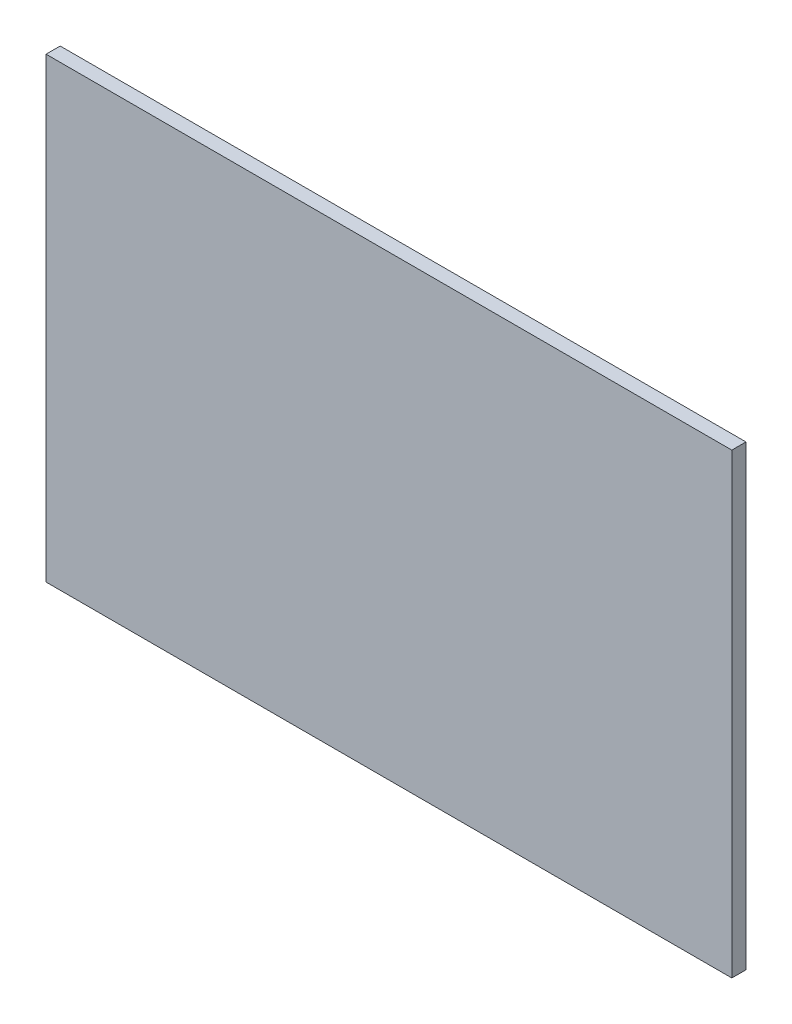
ISO-10303-21;
HEADER;
FILE_DESCRIPTION(('STEP AP214'),'2;1');
FILE_NAME('part.step','',(''),(''),'','','');
FILE_SCHEMA(('AUTOMOTIVE_DESIGN { 1 0 10303 214 1 1 1 1 }'));
ENDSEC;
DATA;
#1=APPLICATION_CONTEXT('core data for automotive mechanical design processes');
#2=APPLICATION_PROTOCOL_DEFINITION('international standard','automotive_design',2000,#1);
#3=PRODUCT_CONTEXT('',#1,'mechanical');
#4=PRODUCT('Part','Part','',(#3));
#5=PRODUCT_RELATED_PRODUCT_CATEGORY('part','',(#4));
#6=PRODUCT_DEFINITION_FORMATION('','',#4);
#7=PRODUCT_DEFINITION_CONTEXT('part definition',#1,'design');
#8=PRODUCT_DEFINITION('design','',#6,#7);
#9=PRODUCT_DEFINITION_SHAPE('','',#8);
#10=(LENGTH_UNIT() NAMED_UNIT(*) SI_UNIT(.MILLI.,.METRE.));
#11=(NAMED_UNIT(*) PLANE_ANGLE_UNIT() SI_UNIT($,.RADIAN.));
#12=(NAMED_UNIT(*) SI_UNIT($,.STERADIAN.) SOLID_ANGLE_UNIT());
#13=UNCERTAINTY_MEASURE_WITH_UNIT(LENGTH_MEASURE(1.E-05),#10,'distance_accuracy_value','');
#14=(GEOMETRIC_REPRESENTATION_CONTEXT(3) GLOBAL_UNCERTAINTY_ASSIGNED_CONTEXT((#13)) GLOBAL_UNIT_ASSIGNED_CONTEXT((#10,
#11,#12)) REPRESENTATION_CONTEXT('',''));
#15=CARTESIAN_POINT('',(0.,0.,0.));
#16=DIRECTION('',(0.,0.,1.));
#17=DIRECTION('',(1.,0.,0.));
#18=AXIS2_PLACEMENT_3D('',#15,#16,#17);
#19=CARTESIAN_POINT('',(0.,0.,6.));
#20=DIRECTION('',(1.,0.,0.));
#21=DIRECTION('',(0.,1.,0.));
#22=AXIS2_PLACEMENT_3D('',#19,#20,#21);
#23=PLANE('',#22);
#24=DIRECTION('',(0.,-1.,0.));
#25=VECTOR('',#24,1.);
#26=CARTESIAN_POINT('',(0.,0.,0.));
#27=LINE('',#26,#25);
#28=CARTESIAN_POINT('',(0.,0.,0.));
#29=VERTEX_POINT('',#28);
#30=CARTESIAN_POINT('',(0.,-194.,0.));
#31=VERTEX_POINT('',#30);
#32=EDGE_CURVE('E96',#29,#31,#27,.T.);
#33=ORIENTED_EDGE('',*,*,#32,.T.);
#34=DIRECTION('',(0.,0.,-1.));
#35=VECTOR('',#34,1.);
#36=CARTESIAN_POINT('',(0.,-194.,6.));
#37=LINE('',#36,#35);
#38=CARTESIAN_POINT('',(0.,-194.,6.));
#39=VERTEX_POINT('',#38);
#40=EDGE_CURVE('E11',#39,#31,#37,.T.);
#41=ORIENTED_EDGE('',*,*,#40,.F.);
#42=DIRECTION('',(0.,-1.,0.));
#43=VECTOR('',#42,1.);
#44=CARTESIAN_POINT('',(0.,0.,6.));
#45=LINE('',#44,#43);
#46=CARTESIAN_POINT('',(0.,0.,6.));
#47=VERTEX_POINT('',#46);
#48=EDGE_CURVE('E82',#47,#39,#45,.T.);
#49=ORIENTED_EDGE('',*,*,#48,.F.);
#50=DIRECTION('',(0.,0.,-1.));
#51=VECTOR('',#50,1.);
#52=CARTESIAN_POINT('',(0.,0.,6.));
#53=LINE('',#52,#51);
#54=EDGE_CURVE('E49',#47,#29,#53,.T.);
#55=ORIENTED_EDGE('',*,*,#54,.T.);
#56=EDGE_LOOP('',(#33,#41,#49,#55));
#57=FACE_BOUND('',#56,.T.);
#58=ADVANCED_FACE('F33',(#57),#23,.F.);
#59=CARTESIAN_POINT('',(0.,-194.,6.));
#60=DIRECTION('',(0.,1.,0.));
#61=DIRECTION('',(-1.,0.,0.));
#62=AXIS2_PLACEMENT_3D('',#59,#60,#61);
#63=PLANE('',#62);
#64=DIRECTION('',(1.,0.,0.));
#65=VECTOR('',#64,1.);
#66=CARTESIAN_POINT('',(0.,-194.,0.));
#67=LINE('',#66,#65);
#68=CARTESIAN_POINT('',(291.,-194.,0.));
#69=VERTEX_POINT('',#68);
#70=EDGE_CURVE('E88',#31,#69,#67,.T.);
#71=ORIENTED_EDGE('',*,*,#70,.T.);
#72=DIRECTION('',(0.,0.,-1.));
#73=VECTOR('',#72,1.);
#74=CARTESIAN_POINT('',(291.,-194.,6.));
#75=LINE('',#74,#73);
#76=CARTESIAN_POINT('',(291.,-194.,6.));
#77=VERTEX_POINT('',#76);
#78=EDGE_CURVE('E41',#77,#69,#75,.T.);
#79=ORIENTED_EDGE('',*,*,#78,.F.);
#80=DIRECTION('',(1.,0.,0.));
#81=VECTOR('',#80,1.);
#82=CARTESIAN_POINT('',(0.,-194.,6.));
#83=LINE('',#82,#81);
#84=EDGE_CURVE('E75',#39,#77,#83,.T.);
#85=ORIENTED_EDGE('',*,*,#84,.F.);
#86=ORIENTED_EDGE('',*,*,#40,.T.);
#87=EDGE_LOOP('',(#71,#79,#85,#86));
#88=FACE_BOUND('',#87,.T.);
#89=ADVANCED_FACE('F87',(#88),#63,.F.);
#90=CARTESIAN_POINT('',(291.,0.,6.));
#91=DIRECTION('',(1.,0.,0.));
#92=DIRECTION('',(0.,0.,-1.));
#93=AXIS2_PLACEMENT_3D('',#90,#91,#92);
#94=PLANE('',#93);
#95=DIRECTION('',(0.,-1.,0.));
#96=VECTOR('',#95,1.);
#97=CARTESIAN_POINT('',(291.,0.,0.));
#98=LINE('',#97,#96);
#99=CARTESIAN_POINT('',(291.,0.,0.));
#100=VERTEX_POINT('',#99);
#101=EDGE_CURVE('E99',#100,#69,#98,.T.);
#102=ORIENTED_EDGE('',*,*,#101,.F.);
#103=DIRECTION('',(0.,0.,-1.));
#104=VECTOR('',#103,1.);
#105=CARTESIAN_POINT('',(291.,0.,6.));
#106=LINE('',#105,#104);
#107=CARTESIAN_POINT('',(291.,0.,6.));
#108=VERTEX_POINT('',#107);
#109=EDGE_CURVE('E64',#108,#100,#106,.T.);
#110=ORIENTED_EDGE('',*,*,#109,.F.);
#111=DIRECTION('',(0.,-1.,0.));
#112=VECTOR('',#111,1.);
#113=CARTESIAN_POINT('',(291.,-122.,6.));
#114=LINE('',#113,#112);
#115=EDGE_CURVE('E81',#108,#77,#114,.T.);
#116=ORIENTED_EDGE('',*,*,#115,.T.);
#117=ORIENTED_EDGE('',*,*,#78,.T.);
#118=EDGE_LOOP('',(#102,#110,#116,#117));
#119=FACE_BOUND('',#118,.T.);
#120=ADVANCED_FACE('F90',(#119),#94,.T.);
#121=CARTESIAN_POINT('',(0.,0.,6.));
#122=DIRECTION('',(0.,1.,0.));
#123=DIRECTION('',(0.,0.,1.));
#124=AXIS2_PLACEMENT_3D('',#121,#122,#123);
#125=PLANE('',#124);
#126=DIRECTION('',(1.,0.,0.));
#127=VECTOR('',#126,1.);
#128=CARTESIAN_POINT('',(0.,0.,0.));
#129=LINE('',#128,#127);
#130=EDGE_CURVE('E101',#29,#100,#129,.T.);
#131=ORIENTED_EDGE('',*,*,#130,.F.);
#132=ORIENTED_EDGE('',*,*,#54,.F.);
#133=DIRECTION('',(1.,0.,0.));
#134=VECTOR('',#133,1.);
#135=CARTESIAN_POINT('',(0.,0.,6.));
#136=LINE('',#135,#134);
#137=EDGE_CURVE('E91',#47,#108,#136,.T.);
#138=ORIENTED_EDGE('',*,*,#137,.T.);
#139=ORIENTED_EDGE('',*,*,#109,.T.);
#140=EDGE_LOOP('',(#131,#132,#138,#139));
#141=FACE_BOUND('',#140,.T.);
#142=ADVANCED_FACE('F107',(#141),#125,.T.);
#143=CARTESIAN_POINT('',(0.,0.,6.));
#144=DIRECTION('',(0.,0.,1.));
#145=DIRECTION('',(1.,0.,0.));
#146=AXIS2_PLACEMENT_3D('',#143,#144,#145);
#147=PLANE('',#146);
#148=ORIENTED_EDGE('',*,*,#48,.T.);
#149=ORIENTED_EDGE('',*,*,#84,.T.);
#150=ORIENTED_EDGE('',*,*,#115,.F.);
#151=ORIENTED_EDGE('',*,*,#137,.F.);
#152=EDGE_LOOP('',(#148,#149,#150,#151));
#153=FACE_BOUND('',#152,.T.);
#154=ADVANCED_FACE('F78',(#153),#147,.T.);
#155=CARTESIAN_POINT('',(0.,0.,0.));
#156=DIRECTION('',(0.,0.,1.));
#157=DIRECTION('',(1.,0.,0.));
#158=AXIS2_PLACEMENT_3D('',#155,#156,#157);
#159=PLANE('',#158);
#160=ORIENTED_EDGE('',*,*,#32,.F.);
#161=ORIENTED_EDGE('',*,*,#130,.T.);
#162=ORIENTED_EDGE('',*,*,#101,.T.);
#163=ORIENTED_EDGE('',*,*,#70,.F.);
#164=EDGE_LOOP('',(#160,#161,#162,#163));
#165=FACE_BOUND('',#164,.T.);
#166=ADVANCED_FACE('F106',(#165),#159,.F.);
#167=CLOSED_SHELL('',(#58,#89,#120,#142,#154,#166));
#168=MANIFOLD_SOLID_BREP('B2',#167);
#169=ADVANCED_BREP_SHAPE_REPRESENTATION('',(#18,#168),#14);
#170=SHAPE_DEFINITION_REPRESENTATION(#9,#169);
ENDSEC;
END-ISO-10303-21;
